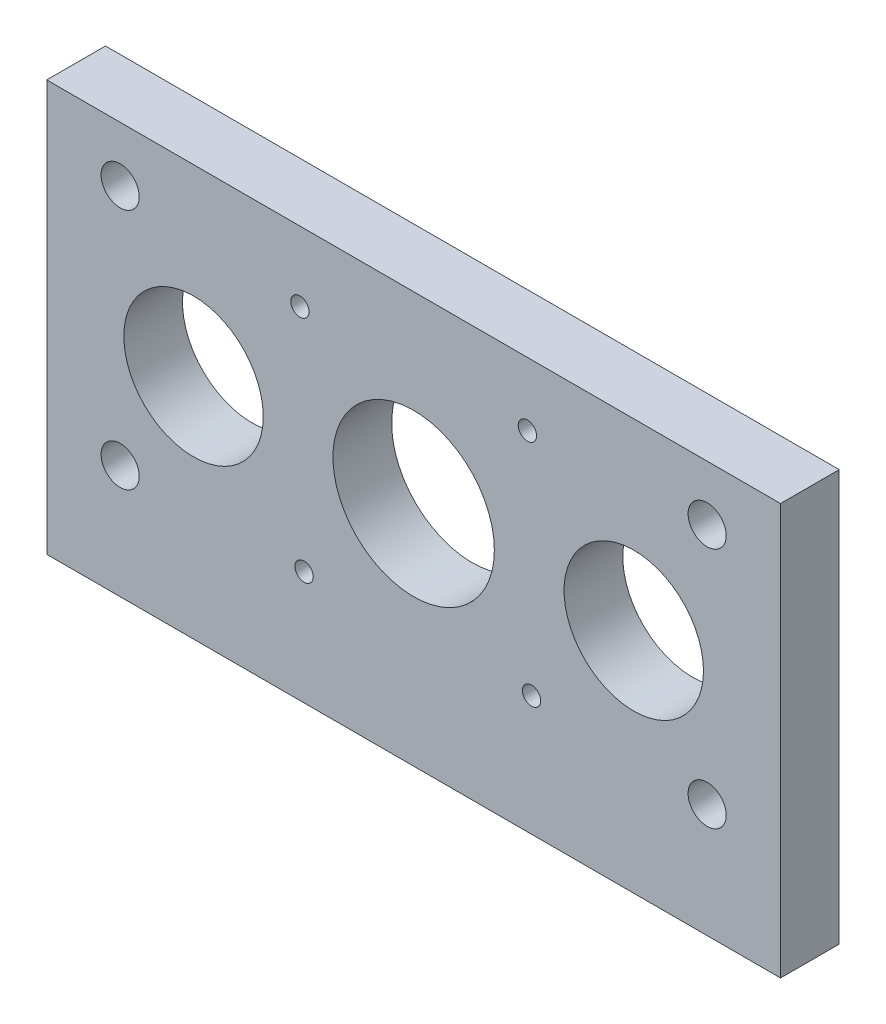
ISO-10303-21;
HEADER;
FILE_DESCRIPTION(('STEP AP214'),'2;1');
FILE_NAME('part.step','',(''),(''),'','','');
FILE_SCHEMA(('AUTOMOTIVE_DESIGN { 1 0 10303 214 1 1 1 1 }'));
ENDSEC;
DATA;
#1=APPLICATION_CONTEXT('core data for automotive mechanical design processes');
#2=APPLICATION_PROTOCOL_DEFINITION('international standard','automotive_design',2000,#1);
#3=PRODUCT_CONTEXT('',#1,'mechanical');
#4=PRODUCT('Part','Part','',(#3));
#5=PRODUCT_RELATED_PRODUCT_CATEGORY('part','',(#4));
#6=PRODUCT_DEFINITION_FORMATION('','',#4);
#7=PRODUCT_DEFINITION_CONTEXT('part definition',#1,'design');
#8=PRODUCT_DEFINITION('design','',#6,#7);
#9=PRODUCT_DEFINITION_SHAPE('','',#8);
#10=(LENGTH_UNIT() NAMED_UNIT(*) SI_UNIT(.MILLI.,.METRE.));
#11=(NAMED_UNIT(*) PLANE_ANGLE_UNIT() SI_UNIT($,.RADIAN.));
#12=(NAMED_UNIT(*) SI_UNIT($,.STERADIAN.) SOLID_ANGLE_UNIT());
#13=UNCERTAINTY_MEASURE_WITH_UNIT(LENGTH_MEASURE(1.E-05),#10,'distance_accuracy_value','');
#14=(GEOMETRIC_REPRESENTATION_CONTEXT(3) GLOBAL_UNCERTAINTY_ASSIGNED_CONTEXT((#13)) GLOBAL_UNIT_ASSIGNED_CONTEXT((#10,
#11,#12)) REPRESENTATION_CONTEXT('',''));
#15=CARTESIAN_POINT('',(0.,0.,0.));
#16=DIRECTION('',(0.,0.,1.));
#17=DIRECTION('',(1.,0.,0.));
#18=AXIS2_PLACEMENT_3D('',#15,#16,#17);
#19=CARTESIAN_POINT('',(0.,0.,8.));
#20=DIRECTION('',(0.,0.,1.));
#21=DIRECTION('',(1.,0.,0.));
#22=AXIS2_PLACEMENT_3D('',#19,#20,#21);
#23=PLANE('',#22);
#24=CARTESIAN_POINT('',(-42.0310531512819,20.7576866764275,8.));
#25=DIRECTION('',(0.,0.,1.));
#26=DIRECTION('',(1.,0.,0.));
#27=AXIS2_PLACEMENT_3D('',#24,#25,#26);
#28=CIRCLE('',#27,2.59999999999998);
#29=CARTESIAN_POINT('',(-39.431053151282,20.7576866764275,8.));
#30=VERTEX_POINT('',#29);
#31=EDGE_CURVE('E211',#30,#30,#28,.T.);
#32=ORIENTED_EDGE('',*,*,#31,.F.);
#33=EDGE_LOOP('',(#32));
#34=FACE_BOUND('',#33,.T.);
#35=CARTESIAN_POINT('',(37.9689468487181,20.7576866764275,8.));
#36=DIRECTION('',(0.,0.,1.));
#37=DIRECTION('',(1.,0.,0.));
#38=AXIS2_PLACEMENT_3D('',#35,#36,#37);
#39=CIRCLE('',#38,2.59999999999999);
#40=CARTESIAN_POINT('',(40.5689468487181,20.7576866764275,8.));
#41=VERTEX_POINT('',#40);
#42=EDGE_CURVE('E203',#41,#41,#39,.T.);
#43=ORIENTED_EDGE('',*,*,#42,.F.);
#44=EDGE_LOOP('',(#43));
#45=FACE_BOUND('',#44,.T.);
#46=CARTESIAN_POINT('',(37.9689468487181,-12.2423133235725,8.));
#47=DIRECTION('',(0.,0.,1.));
#48=DIRECTION('',(1.,0.,0.));
#49=AXIS2_PLACEMENT_3D('',#46,#47,#48);
#50=CIRCLE('',#49,2.59999999999999);
#51=CARTESIAN_POINT('',(40.5689468487181,-12.2423133235725,8.));
#52=VERTEX_POINT('',#51);
#53=EDGE_CURVE('E195',#52,#52,#50,.T.);
#54=ORIENTED_EDGE('',*,*,#53,.F.);
#55=EDGE_LOOP('',(#54));
#56=FACE_BOUND('',#55,.T.);
#57=CARTESIAN_POINT('',(-42.0310531512819,-12.2423133235725,8.));
#58=DIRECTION('',(0.,0.,1.));
#59=DIRECTION('',(1.,0.,0.));
#60=AXIS2_PLACEMENT_3D('',#57,#58,#59);
#61=CIRCLE('',#60,2.59999999999998);
#62=CARTESIAN_POINT('',(-39.431053151282,-12.2423133235725,8.));
#63=VERTEX_POINT('',#62);
#64=EDGE_CURVE('E187',#63,#63,#61,.T.);
#65=ORIENTED_EDGE('',*,*,#64,.F.);
#66=EDGE_LOOP('',(#65));
#67=FACE_BOUND('',#66,.T.);
#68=CARTESIAN_POINT('',(14.0376319672383,-11.3826304829995,8.));
#69=DIRECTION('',(0.,0.,1.));
#70=DIRECTION('',(1.,0.,0.));
#71=AXIS2_PLACEMENT_3D('',#68,#69,#70);
#72=CIRCLE('',#71,1.24999999999999);
#73=CARTESIAN_POINT('',(15.2876319672382,-11.3826304829995,8.));
#74=VERTEX_POINT('',#73);
#75=EDGE_CURVE('E151',#74,#74,#72,.T.);
#76=ORIENTED_EDGE('',*,*,#75,.F.);
#77=EDGE_LOOP('',(#76));
#78=FACE_BOUND('',#77,.T.);
#79=CARTESIAN_POINT('',(-16.9623680327617,-12.2423133235725,8.));
#80=DIRECTION('',(0.,0.,1.));
#81=DIRECTION('',(1.,0.,0.));
#82=AXIS2_PLACEMENT_3D('',#79,#80,#81);
#83=CIRCLE('',#82,1.24999999999999);
#84=CARTESIAN_POINT('',(-15.7123680327617,-12.2423133235725,8.));
#85=VERTEX_POINT('',#84);
#86=EDGE_CURVE('E155',#85,#85,#83,.T.);
#87=ORIENTED_EDGE('',*,*,#86,.F.);
#88=EDGE_LOOP('',(#87));
#89=FACE_BOUND('',#88,.T.);
#90=CARTESIAN_POINT('',(-17.5310531512819,18.7576866764275,8.));
#91=DIRECTION('',(0.,0.,1.));
#92=DIRECTION('',(1.,0.,0.));
#93=AXIS2_PLACEMENT_3D('',#90,#91,#92);
#94=CIRCLE('',#93,1.24999999999999);
#95=CARTESIAN_POINT('',(-16.2810531512819,18.7576866764275,8.));
#96=VERTEX_POINT('',#95);
#97=EDGE_CURVE('E159',#96,#96,#94,.T.);
#98=ORIENTED_EDGE('',*,*,#97,.F.);
#99=EDGE_LOOP('',(#98));
#100=FACE_BOUND('',#99,.T.);
#101=CARTESIAN_POINT('',(13.4689468487181,19.6173695170005,8.));
#102=DIRECTION('',(0.,0.,1.));
#103=DIRECTION('',(1.,0.,0.));
#104=AXIS2_PLACEMENT_3D('',#101,#102,#103);
#105=CIRCLE('',#104,1.24999999999999);
#106=CARTESIAN_POINT('',(14.7189468487181,19.6173695170005,8.));
#107=VERTEX_POINT('',#106);
#108=EDGE_CURVE('E163',#107,#107,#105,.T.);
#109=ORIENTED_EDGE('',*,*,#108,.F.);
#110=EDGE_LOOP('',(#109));
#111=FACE_BOUND('',#110,.T.);
#112=CARTESIAN_POINT('',(-2.03105315128194,3.25768667642752,8.));
#113=DIRECTION('',(0.,0.,1.));
#114=DIRECTION('',(1.,0.,0.));
#115=AXIS2_PLACEMENT_3D('',#112,#113,#114);
#116=CIRCLE('',#115,11.);
#117=CARTESIAN_POINT('',(8.96894684871806,3.25768667642752,8.));
#118=VERTEX_POINT('',#117);
#119=EDGE_CURVE('E147',#118,#118,#116,.T.);
#120=ORIENTED_EDGE('',*,*,#119,.F.);
#121=EDGE_LOOP('',(#120));
#122=FACE_BOUND('',#121,.T.);
#123=CARTESIAN_POINT('',(27.9689468487181,3.25768667642752,8.));
#124=DIRECTION('',(0.,0.,1.));
#125=DIRECTION('',(1.,0.,0.));
#126=AXIS2_PLACEMENT_3D('',#123,#124,#125);
#127=CIRCLE('',#126,9.5);
#128=CARTESIAN_POINT('',(37.4689468487181,3.25768667642752,8.));
#129=VERTEX_POINT('',#128);
#130=EDGE_CURVE('E136',#129,#129,#127,.T.);
#131=ORIENTED_EDGE('',*,*,#130,.F.);
#132=EDGE_LOOP('',(#131));
#133=FACE_BOUND('',#132,.T.);
#134=DIRECTION('',(0.,-1.,0.));
#135=VECTOR('',#134,1.);
#136=CARTESIAN_POINT('',(-52.0310531512819,28.2576866764275,8.));
#137=LINE('',#136,#135);
#138=CARTESIAN_POINT('',(-52.0310531512819,28.2576866764275,8.));
#139=VERTEX_POINT('',#138);
#140=CARTESIAN_POINT('',(-52.0310531512819,-27.7423133235725,8.));
#141=VERTEX_POINT('',#140);
#142=EDGE_CURVE('E93',#139,#141,#137,.T.);
#143=ORIENTED_EDGE('',*,*,#142,.T.);
#144=DIRECTION('',(1.,0.,0.));
#145=VECTOR('',#144,1.);
#146=CARTESIAN_POINT('',(-52.0310531512819,-27.7423133235725,8.));
#147=LINE('',#146,#145);
#148=CARTESIAN_POINT('',(47.9689468487181,-27.7423133235725,8.));
#149=VERTEX_POINT('',#148);
#150=EDGE_CURVE('E88',#141,#149,#147,.T.);
#151=ORIENTED_EDGE('',*,*,#150,.T.);
#152=DIRECTION('',(0.,1.,0.));
#153=VECTOR('',#152,1.);
#154=CARTESIAN_POINT('',(47.9689468487181,28.2576866764275,8.));
#155=LINE('',#154,#153);
#156=CARTESIAN_POINT('',(47.9689468487181,28.2576866764275,8.));
#157=VERTEX_POINT('',#156);
#158=EDGE_CURVE('E91',#149,#157,#155,.T.);
#159=ORIENTED_EDGE('',*,*,#158,.T.);
#160=DIRECTION('',(-1.,0.,0.));
#161=VECTOR('',#160,1.);
#162=CARTESIAN_POINT('',(-52.0310531512819,28.2576866764275,8.));
#163=LINE('',#162,#161);
#164=EDGE_CURVE('E58',#157,#139,#163,.T.);
#165=ORIENTED_EDGE('',*,*,#164,.T.);
#166=EDGE_LOOP('',(#143,#151,#159,#165));
#167=FACE_BOUND('',#166,.T.);
#168=CARTESIAN_POINT('',(-32.031053151282,3.25768667642752,8.));
#169=DIRECTION('',(0.,0.,1.));
#170=DIRECTION('',(1.,0.,0.));
#171=AXIS2_PLACEMENT_3D('',#168,#169,#170);
#172=CIRCLE('',#171,9.50000000000001);
#173=CARTESIAN_POINT('',(-22.5310531512819,3.25768667642752,8.));
#174=VERTEX_POINT('',#173);
#175=EDGE_CURVE('E114',#174,#174,#172,.T.);
#176=ORIENTED_EDGE('',*,*,#175,.F.);
#177=EDGE_LOOP('',(#176));
#178=FACE_BOUND('',#177,.T.);
#179=ADVANCED_FACE('F39',(#34,#45,#56,#67,#78,#89,#100,#111,#122,#133,#167,#178),#23,.T.);
#180=CARTESIAN_POINT('',(0.,0.,0.));
#181=DIRECTION('',(0.,0.,1.));
#182=DIRECTION('',(1.,0.,0.));
#183=AXIS2_PLACEMENT_3D('',#180,#181,#182);
#184=PLANE('',#183);
#185=CARTESIAN_POINT('',(-42.0310531512819,20.7576866764275,0.));
#186=DIRECTION('',(0.,0.,1.));
#187=DIRECTION('',(1.,0.,0.));
#188=AXIS2_PLACEMENT_3D('',#185,#186,#187);
#189=CIRCLE('',#188,2.59999999999999);
#190=CARTESIAN_POINT('',(-39.4310531512819,20.7576866764275,0.));
#191=VERTEX_POINT('',#190);
#192=EDGE_CURVE('E207',#191,#191,#189,.T.);
#193=ORIENTED_EDGE('',*,*,#192,.T.);
#194=EDGE_LOOP('',(#193));
#195=FACE_BOUND('',#194,.T.);
#196=CARTESIAN_POINT('',(37.9689468487181,20.7576866764275,0.));
#197=DIRECTION('',(0.,0.,1.));
#198=DIRECTION('',(1.,0.,0.));
#199=AXIS2_PLACEMENT_3D('',#196,#197,#198);
#200=CIRCLE('',#199,2.59999999999999);
#201=CARTESIAN_POINT('',(40.5689468487181,20.7576866764275,0.));
#202=VERTEX_POINT('',#201);
#203=EDGE_CURVE('E199',#202,#202,#200,.T.);
#204=ORIENTED_EDGE('',*,*,#203,.T.);
#205=EDGE_LOOP('',(#204));
#206=FACE_BOUND('',#205,.T.);
#207=CARTESIAN_POINT('',(37.9689468487181,-12.2423133235725,0.));
#208=DIRECTION('',(0.,0.,1.));
#209=DIRECTION('',(1.,0.,0.));
#210=AXIS2_PLACEMENT_3D('',#207,#208,#209);
#211=CIRCLE('',#210,2.59999999999999);
#212=CARTESIAN_POINT('',(40.5689468487181,-12.2423133235725,0.));
#213=VERTEX_POINT('',#212);
#214=EDGE_CURVE('E191',#213,#213,#211,.T.);
#215=ORIENTED_EDGE('',*,*,#214,.T.);
#216=EDGE_LOOP('',(#215));
#217=FACE_BOUND('',#216,.T.);
#218=CARTESIAN_POINT('',(-42.0310531512819,-12.2423133235725,0.));
#219=DIRECTION('',(0.,0.,1.));
#220=DIRECTION('',(1.,0.,0.));
#221=AXIS2_PLACEMENT_3D('',#218,#219,#220);
#222=CIRCLE('',#221,2.59999999999999);
#223=CARTESIAN_POINT('',(-39.4310531512819,-12.2423133235725,0.));
#224=VERTEX_POINT('',#223);
#225=EDGE_CURVE('E177',#224,#224,#222,.T.);
#226=ORIENTED_EDGE('',*,*,#225,.T.);
#227=EDGE_LOOP('',(#226));
#228=FACE_BOUND('',#227,.T.);
#229=CARTESIAN_POINT('',(14.0376319672383,-11.3826304829995,0.));
#230=DIRECTION('',(0.,0.,-1.));
#231=DIRECTION('',(-1.,0.,0.));
#232=AXIS2_PLACEMENT_3D('',#229,#230,#231);
#233=CIRCLE('',#232,1.24999999999999);
#234=CARTESIAN_POINT('',(12.7876319672383,-11.3826304829995,0.));
#235=VERTEX_POINT('',#234);
#236=EDGE_CURVE('E172',#235,#235,#233,.T.);
#237=ORIENTED_EDGE('',*,*,#236,.F.);
#238=EDGE_LOOP('',(#237));
#239=FACE_BOUND('',#238,.T.);
#240=CARTESIAN_POINT('',(-16.9623680327617,-12.2423133235725,0.));
#241=DIRECTION('',(0.,0.,-1.));
#242=DIRECTION('',(-1.,0.,0.));
#243=AXIS2_PLACEMENT_3D('',#240,#241,#242);
#244=CIRCLE('',#243,1.24999999999999);
#245=CARTESIAN_POINT('',(-18.2123680327617,-12.2423133235725,0.));
#246=VERTEX_POINT('',#245);
#247=EDGE_CURVE('E176',#246,#246,#244,.T.);
#248=ORIENTED_EDGE('',*,*,#247,.F.);
#249=EDGE_LOOP('',(#248));
#250=FACE_BOUND('',#249,.T.);
#251=CARTESIAN_POINT('',(-17.5310531512819,18.7576866764275,0.));
#252=DIRECTION('',(0.,0.,-1.));
#253=DIRECTION('',(-1.,0.,0.));
#254=AXIS2_PLACEMENT_3D('',#251,#252,#253);
#255=CIRCLE('',#254,1.24999999999999);
#256=CARTESIAN_POINT('',(-18.7810531512819,18.7576866764275,0.));
#257=VERTEX_POINT('',#256);
#258=EDGE_CURVE('E171',#257,#257,#255,.T.);
#259=ORIENTED_EDGE('',*,*,#258,.F.);
#260=EDGE_LOOP('',(#259));
#261=FACE_BOUND('',#260,.T.);
#262=CARTESIAN_POINT('',(13.4689468487181,19.6173695170005,0.));
#263=DIRECTION('',(0.,0.,-1.));
#264=DIRECTION('',(-1.,0.,0.));
#265=AXIS2_PLACEMENT_3D('',#262,#263,#264);
#266=CIRCLE('',#265,1.24999999999999);
#267=CARTESIAN_POINT('',(12.2189468487181,19.6173695170005,0.));
#268=VERTEX_POINT('',#267);
#269=EDGE_CURVE('E167',#268,#268,#266,.T.);
#270=ORIENTED_EDGE('',*,*,#269,.F.);
#271=EDGE_LOOP('',(#270));
#272=FACE_BOUND('',#271,.T.);
#273=CARTESIAN_POINT('',(-2.03105315128194,3.25768667642752,0.));
#274=DIRECTION('',(0.,0.,1.));
#275=DIRECTION('',(1.,0.,0.));
#276=AXIS2_PLACEMENT_3D('',#273,#274,#275);
#277=CIRCLE('',#276,11.);
#278=CARTESIAN_POINT('',(8.96894684871806,3.25768667642752,0.));
#279=VERTEX_POINT('',#278);
#280=EDGE_CURVE('E43',#279,#279,#277,.T.);
#281=ORIENTED_EDGE('',*,*,#280,.T.);
#282=EDGE_LOOP('',(#281));
#283=FACE_BOUND('',#282,.T.);
#284=DIRECTION('',(0.,-1.,0.));
#285=VECTOR('',#284,1.);
#286=CARTESIAN_POINT('',(-52.0310531512819,28.2576866764275,0.));
#287=LINE('',#286,#285);
#288=CARTESIAN_POINT('',(-52.0310531512819,28.2576866764275,0.));
#289=VERTEX_POINT('',#288);
#290=CARTESIAN_POINT('',(-52.0310531512819,-27.7423133235725,0.));
#291=VERTEX_POINT('',#290);
#292=EDGE_CURVE('E110',#289,#291,#287,.T.);
#293=ORIENTED_EDGE('',*,*,#292,.F.);
#294=DIRECTION('',(-1.,0.,0.));
#295=VECTOR('',#294,1.);
#296=CARTESIAN_POINT('',(-52.0310531512819,28.2576866764275,0.));
#297=LINE('',#296,#295);
#298=CARTESIAN_POINT('',(47.9689468487181,28.2576866764275,0.));
#299=VERTEX_POINT('',#298);
#300=EDGE_CURVE('E81',#299,#289,#297,.T.);
#301=ORIENTED_EDGE('',*,*,#300,.F.);
#302=DIRECTION('',(0.,1.,0.));
#303=VECTOR('',#302,1.);
#304=CARTESIAN_POINT('',(47.9689468487181,28.2576866764275,0.));
#305=LINE('',#304,#303);
#306=CARTESIAN_POINT('',(47.9689468487181,-27.7423133235725,0.));
#307=VERTEX_POINT('',#306);
#308=EDGE_CURVE('E75',#307,#299,#305,.T.);
#309=ORIENTED_EDGE('',*,*,#308,.F.);
#310=DIRECTION('',(1.,0.,0.));
#311=VECTOR('',#310,1.);
#312=CARTESIAN_POINT('',(-52.0310531512819,-27.7423133235725,0.));
#313=LINE('',#312,#311);
#314=EDGE_CURVE('E98',#291,#307,#313,.T.);
#315=ORIENTED_EDGE('',*,*,#314,.F.);
#316=EDGE_LOOP('',(#293,#301,#309,#315));
#317=FACE_BOUND('',#316,.T.);
#318=CARTESIAN_POINT('',(-32.031053151282,3.25768667642752,0.));
#319=DIRECTION('',(0.,0.,1.));
#320=DIRECTION('',(1.,0.,0.));
#321=AXIS2_PLACEMENT_3D('',#318,#319,#320);
#322=CIRCLE('',#321,9.50000000000001);
#323=CARTESIAN_POINT('',(-22.5310531512819,3.25768667642752,0.));
#324=VERTEX_POINT('',#323);
#325=EDGE_CURVE('E132',#324,#324,#322,.T.);
#326=ORIENTED_EDGE('',*,*,#325,.T.);
#327=EDGE_LOOP('',(#326));
#328=FACE_BOUND('',#327,.T.);
#329=CARTESIAN_POINT('',(27.9689468487181,3.25768667642752,0.));
#330=DIRECTION('',(0.,0.,1.));
#331=DIRECTION('',(1.,0.,0.));
#332=AXIS2_PLACEMENT_3D('',#329,#330,#331);
#333=CIRCLE('',#332,9.5);
#334=CARTESIAN_POINT('',(37.4689468487181,3.25768667642752,0.));
#335=VERTEX_POINT('',#334);
#336=EDGE_CURVE('E140',#335,#335,#333,.T.);
#337=ORIENTED_EDGE('',*,*,#336,.T.);
#338=EDGE_LOOP('',(#337));
#339=FACE_BOUND('',#338,.T.);
#340=ADVANCED_FACE('F127',(#195,#206,#217,#228,#239,#250,#261,#272,#283,#317,#328,#339),#184,.F.);
#341=CARTESIAN_POINT('',(-52.0310531512819,28.2576866764275,8.));
#342=DIRECTION('',(1.,0.,0.));
#343=DIRECTION('',(0.,0.,-1.));
#344=AXIS2_PLACEMENT_3D('',#341,#342,#343);
#345=PLANE('',#344);
#346=ORIENTED_EDGE('',*,*,#292,.T.);
#347=DIRECTION('',(0.,0.,-1.));
#348=VECTOR('',#347,1.);
#349=CARTESIAN_POINT('',(-52.0310531512819,-27.7423133235725,8.));
#350=LINE('',#349,#348);
#351=EDGE_CURVE('E11',#141,#291,#350,.T.);
#352=ORIENTED_EDGE('',*,*,#351,.F.);
#353=ORIENTED_EDGE('',*,*,#142,.F.);
#354=DIRECTION('',(0.,0.,-1.));
#355=VECTOR('',#354,1.);
#356=CARTESIAN_POINT('',(-52.0310531512819,28.2576866764275,8.));
#357=LINE('',#356,#355);
#358=EDGE_CURVE('E106',#139,#289,#357,.T.);
#359=ORIENTED_EDGE('',*,*,#358,.T.);
#360=EDGE_LOOP('',(#346,#352,#353,#359));
#361=FACE_BOUND('',#360,.T.);
#362=ADVANCED_FACE('F41',(#361),#345,.F.);
#363=CARTESIAN_POINT('',(-52.0310531512819,-27.7423133235725,8.));
#364=DIRECTION('',(0.,1.,0.));
#365=DIRECTION('',(0.,0.,1.));
#366=AXIS2_PLACEMENT_3D('',#363,#364,#365);
#367=PLANE('',#366);
#368=ORIENTED_EDGE('',*,*,#314,.T.);
#369=DIRECTION('',(0.,0.,-1.));
#370=VECTOR('',#369,1.);
#371=CARTESIAN_POINT('',(47.9689468487181,-27.7423133235725,8.));
#372=LINE('',#371,#370);
#373=EDGE_CURVE('E50',#149,#307,#372,.T.);
#374=ORIENTED_EDGE('',*,*,#373,.F.);
#375=ORIENTED_EDGE('',*,*,#150,.F.);
#376=ORIENTED_EDGE('',*,*,#351,.T.);
#377=EDGE_LOOP('',(#368,#374,#375,#376));
#378=FACE_BOUND('',#377,.T.);
#379=ADVANCED_FACE('F97',(#378),#367,.F.);
#380=CARTESIAN_POINT('',(47.9689468487181,28.2576866764275,8.));
#381=DIRECTION('',(-1.,0.,0.));
#382=DIRECTION('',(0.,-1.,0.));
#383=AXIS2_PLACEMENT_3D('',#380,#381,#382);
#384=PLANE('',#383);
#385=ORIENTED_EDGE('',*,*,#308,.T.);
#386=DIRECTION('',(0.,0.,-1.));
#387=VECTOR('',#386,1.);
#388=CARTESIAN_POINT('',(47.9689468487181,28.2576866764275,8.));
#389=LINE('',#388,#387);
#390=EDGE_CURVE('E100',#157,#299,#389,.T.);
#391=ORIENTED_EDGE('',*,*,#390,.F.);
#392=ORIENTED_EDGE('',*,*,#158,.F.);
#393=ORIENTED_EDGE('',*,*,#373,.T.);
#394=EDGE_LOOP('',(#385,#391,#392,#393));
#395=FACE_BOUND('',#394,.T.);
#396=ADVANCED_FACE('F102',(#395),#384,.F.);
#397=CARTESIAN_POINT('',(-52.0310531512819,28.2576866764275,8.));
#398=DIRECTION('',(0.,-1.,0.));
#399=DIRECTION('',(0.,0.,-1.));
#400=AXIS2_PLACEMENT_3D('',#397,#398,#399);
#401=PLANE('',#400);
#402=ORIENTED_EDGE('',*,*,#300,.T.);
#403=ORIENTED_EDGE('',*,*,#358,.F.);
#404=ORIENTED_EDGE('',*,*,#164,.F.);
#405=ORIENTED_EDGE('',*,*,#390,.T.);
#406=EDGE_LOOP('',(#402,#403,#404,#405));
#407=FACE_BOUND('',#406,.T.);
#408=ADVANCED_FACE('F124',(#407),#401,.F.);
#409=CARTESIAN_POINT('',(-32.031053151282,3.25768667642752,8.));
#410=DIRECTION('',(0.,0.,-1.));
#411=DIRECTION('',(-1.,0.,0.));
#412=AXIS2_PLACEMENT_3D('',#409,#410,#411);
#413=CYLINDRICAL_SURFACE('',#412,9.50000000000001);
#414=ORIENTED_EDGE('',*,*,#175,.T.);
#415=EDGE_LOOP('',(#414));
#416=FACE_BOUND('',#415,.T.);
#417=ORIENTED_EDGE('',*,*,#325,.F.);
#418=EDGE_LOOP('',(#417));
#419=FACE_BOUND('',#418,.T.);
#420=ADVANCED_FACE('F243',(#416,#419),#413,.F.);
#421=CARTESIAN_POINT('',(27.9689468487181,3.25768667642752,8.));
#422=DIRECTION('',(0.,0.,-1.));
#423=DIRECTION('',(-1.,0.,0.));
#424=AXIS2_PLACEMENT_3D('',#421,#422,#423);
#425=CYLINDRICAL_SURFACE('',#424,9.5);
#426=ORIENTED_EDGE('',*,*,#130,.T.);
#427=EDGE_LOOP('',(#426));
#428=FACE_BOUND('',#427,.T.);
#429=ORIENTED_EDGE('',*,*,#336,.F.);
#430=EDGE_LOOP('',(#429));
#431=FACE_BOUND('',#430,.T.);
#432=ADVANCED_FACE('F239',(#428,#431),#425,.F.);
#433=CARTESIAN_POINT('',(-2.03105315128194,3.25768667642752,-2.));
#434=DIRECTION('',(0.,0.,1.));
#435=DIRECTION('',(1.,0.,0.));
#436=AXIS2_PLACEMENT_3D('',#433,#434,#435);
#437=CYLINDRICAL_SURFACE('',#436,11.);
#438=ORIENTED_EDGE('',*,*,#119,.T.);
#439=EDGE_LOOP('',(#438));
#440=FACE_BOUND('',#439,.T.);
#441=ORIENTED_EDGE('',*,*,#280,.F.);
#442=EDGE_LOOP('',(#441));
#443=FACE_BOUND('',#442,.T.);
#444=ADVANCED_FACE('F242',(#440,#443),#437,.F.);
#445=CARTESIAN_POINT('',(13.4689468487181,19.6173695170005,10.));
#446=DIRECTION('',(0.,0.,-1.));
#447=DIRECTION('',(-1.,0.,0.));
#448=AXIS2_PLACEMENT_3D('',#445,#446,#447);
#449=CYLINDRICAL_SURFACE('',#448,1.24999999999999);
#450=ORIENTED_EDGE('',*,*,#108,.T.);
#451=EDGE_LOOP('',(#450));
#452=FACE_BOUND('',#451,.T.);
#453=ORIENTED_EDGE('',*,*,#269,.T.);
#454=EDGE_LOOP('',(#453));
#455=FACE_BOUND('',#454,.T.);
#456=ADVANCED_FACE('F288',(#452,#455),#449,.F.);
#457=CARTESIAN_POINT('',(-17.5310531512819,18.7576866764275,10.));
#458=DIRECTION('',(0.,0.,-1.));
#459=DIRECTION('',(-1.,0.,0.));
#460=AXIS2_PLACEMENT_3D('',#457,#458,#459);
#461=CYLINDRICAL_SURFACE('',#460,1.24999999999999);
#462=ORIENTED_EDGE('',*,*,#97,.T.);
#463=EDGE_LOOP('',(#462));
#464=FACE_BOUND('',#463,.T.);
#465=ORIENTED_EDGE('',*,*,#258,.T.);
#466=EDGE_LOOP('',(#465));
#467=FACE_BOUND('',#466,.T.);
#468=ADVANCED_FACE('F296',(#464,#467),#461,.F.);
#469=CARTESIAN_POINT('',(-16.9623680327617,-12.2423133235725,10.));
#470=DIRECTION('',(0.,0.,-1.));
#471=DIRECTION('',(-1.,0.,0.));
#472=AXIS2_PLACEMENT_3D('',#469,#470,#471);
#473=CYLINDRICAL_SURFACE('',#472,1.24999999999999);
#474=ORIENTED_EDGE('',*,*,#86,.T.);
#475=EDGE_LOOP('',(#474));
#476=FACE_BOUND('',#475,.T.);
#477=ORIENTED_EDGE('',*,*,#247,.T.);
#478=EDGE_LOOP('',(#477));
#479=FACE_BOUND('',#478,.T.);
#480=ADVANCED_FACE('F304',(#476,#479),#473,.F.);
#481=CARTESIAN_POINT('',(14.0376319672383,-11.3826304829995,10.));
#482=DIRECTION('',(0.,0.,-1.));
#483=DIRECTION('',(-1.,0.,0.));
#484=AXIS2_PLACEMENT_3D('',#481,#482,#483);
#485=CYLINDRICAL_SURFACE('',#484,1.24999999999999);
#486=ORIENTED_EDGE('',*,*,#75,.T.);
#487=EDGE_LOOP('',(#486));
#488=FACE_BOUND('',#487,.T.);
#489=ORIENTED_EDGE('',*,*,#236,.T.);
#490=EDGE_LOOP('',(#489));
#491=FACE_BOUND('',#490,.T.);
#492=ADVANCED_FACE('F312',(#488,#491),#485,.F.);
#493=CARTESIAN_POINT('',(-42.0310531512819,-12.2423133235725,8.));
#494=DIRECTION('',(0.,0.,1.));
#495=DIRECTION('',(1.,0.,0.));
#496=AXIS2_PLACEMENT_3D('',#493,#494,#495);
#497=CYLINDRICAL_SURFACE('',#496,2.59999999999999);
#498=ORIENTED_EDGE('',*,*,#225,.F.);
#499=EDGE_LOOP('',(#498));
#500=FACE_BOUND('',#499,.T.);
#501=ORIENTED_EDGE('',*,*,#64,.T.);
#502=EDGE_LOOP('',(#501));
#503=FACE_BOUND('',#502,.T.);
#504=ADVANCED_FACE('F320',(#500,#503),#497,.F.);
#505=CARTESIAN_POINT('',(37.9689468487181,-12.2423133235725,8.));
#506=DIRECTION('',(0.,0.,1.));
#507=DIRECTION('',(1.,0.,0.));
#508=AXIS2_PLACEMENT_3D('',#505,#506,#507);
#509=CYLINDRICAL_SURFACE('',#508,2.59999999999999);
#510=ORIENTED_EDGE('',*,*,#214,.F.);
#511=EDGE_LOOP('',(#510));
#512=FACE_BOUND('',#511,.T.);
#513=ORIENTED_EDGE('',*,*,#53,.T.);
#514=EDGE_LOOP('',(#513));
#515=FACE_BOUND('',#514,.T.);
#516=ADVANCED_FACE('F329',(#512,#515),#509,.F.);
#517=CARTESIAN_POINT('',(37.9689468487181,20.7576866764275,8.));
#518=DIRECTION('',(0.,0.,1.));
#519=DIRECTION('',(1.,0.,0.));
#520=AXIS2_PLACEMENT_3D('',#517,#518,#519);
#521=CYLINDRICAL_SURFACE('',#520,2.59999999999999);
#522=ORIENTED_EDGE('',*,*,#203,.F.);
#523=EDGE_LOOP('',(#522));
#524=FACE_BOUND('',#523,.T.);
#525=ORIENTED_EDGE('',*,*,#42,.T.);
#526=EDGE_LOOP('',(#525));
#527=FACE_BOUND('',#526,.T.);
#528=ADVANCED_FACE('F337',(#524,#527),#521,.F.);
#529=CARTESIAN_POINT('',(-42.0310531512819,20.7576866764275,8.));
#530=DIRECTION('',(0.,0.,1.));
#531=DIRECTION('',(1.,0.,0.));
#532=AXIS2_PLACEMENT_3D('',#529,#530,#531);
#533=CYLINDRICAL_SURFACE('',#532,2.59999999999999);
#534=ORIENTED_EDGE('',*,*,#192,.F.);
#535=EDGE_LOOP('',(#534));
#536=FACE_BOUND('',#535,.T.);
#537=ORIENTED_EDGE('',*,*,#31,.T.);
#538=EDGE_LOOP('',(#537));
#539=FACE_BOUND('',#538,.T.);
#540=ADVANCED_FACE('F216',(#536,#539),#533,.F.);
#541=CLOSED_SHELL('',(#179,#340,#362,#379,#396,#408,#420,#432,#444,#456,#468,#480,#492,#504,
#516,#528,#540));
#542=MANIFOLD_SOLID_BREP('B2',#541);
#543=ADVANCED_BREP_SHAPE_REPRESENTATION('',(#18,#542),#14);
#544=SHAPE_DEFINITION_REPRESENTATION(#9,#543);
ENDSEC;
END-ISO-10303-21;
